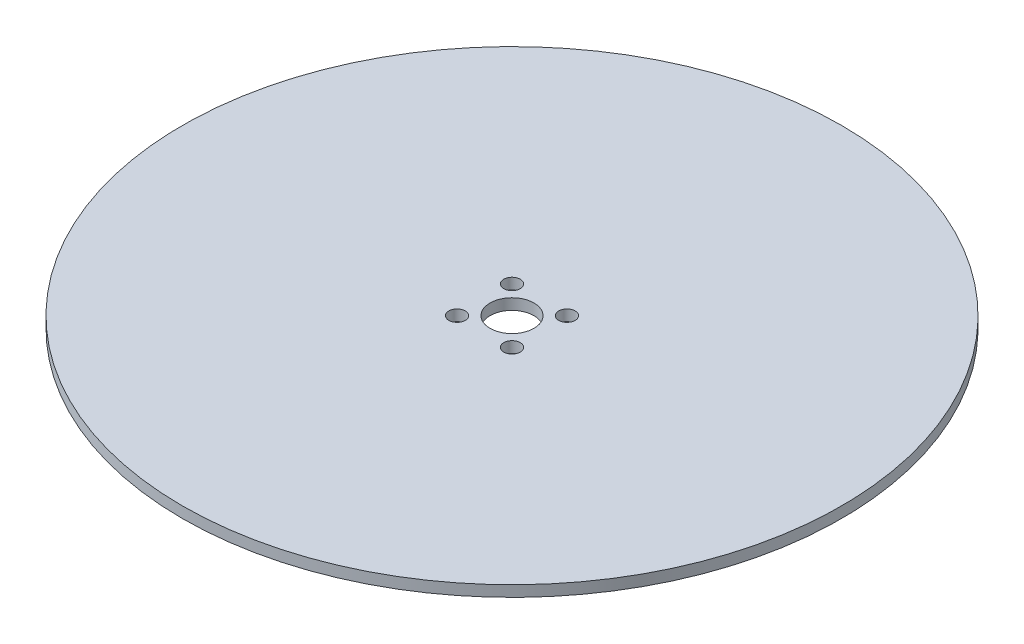
ISO-10303-21;
HEADER;
FILE_DESCRIPTION(('STEP AP214'),'2;1');
FILE_NAME('part.step','',(''),(''),'','','');
FILE_SCHEMA(('AUTOMOTIVE_DESIGN { 1 0 10303 214 1 1 1 1 }'));
ENDSEC;
DATA;
#1=APPLICATION_CONTEXT('core data for automotive mechanical design processes');
#2=APPLICATION_PROTOCOL_DEFINITION('international standard','automotive_design',2000,#1);
#3=PRODUCT_CONTEXT('',#1,'mechanical');
#4=PRODUCT('Part','Part','',(#3));
#5=PRODUCT_RELATED_PRODUCT_CATEGORY('part','',(#4));
#6=PRODUCT_DEFINITION_FORMATION('','',#4);
#7=PRODUCT_DEFINITION_CONTEXT('part definition',#1,'design');
#8=PRODUCT_DEFINITION('design','',#6,#7);
#9=PRODUCT_DEFINITION_SHAPE('','',#8);
#10=(LENGTH_UNIT() NAMED_UNIT(*) SI_UNIT(.MILLI.,.METRE.));
#11=(NAMED_UNIT(*) PLANE_ANGLE_UNIT() SI_UNIT($,.RADIAN.));
#12=(NAMED_UNIT(*) SI_UNIT($,.STERADIAN.) SOLID_ANGLE_UNIT());
#13=UNCERTAINTY_MEASURE_WITH_UNIT(LENGTH_MEASURE(1.E-05),#10,'distance_accuracy_value','');
#14=(GEOMETRIC_REPRESENTATION_CONTEXT(3) GLOBAL_UNCERTAINTY_ASSIGNED_CONTEXT((#13)) GLOBAL_UNIT_ASSIGNED_CONTEXT((#10,
#11,#12)) REPRESENTATION_CONTEXT('',''));
#15=CARTESIAN_POINT('',(0.,0.,0.));
#16=DIRECTION('',(0.,0.,1.));
#17=DIRECTION('',(1.,0.,0.));
#18=AXIS2_PLACEMENT_3D('',#15,#16,#17);
#19=CARTESIAN_POINT('',(0.,2.,0.));
#20=DIRECTION('',(0.,-1.,0.));
#21=DIRECTION('',(0.,0.,-1.));
#22=AXIS2_PLACEMENT_3D('',#19,#20,#21);
#23=CYLINDRICAL_SURFACE('',#22,60.);
#24=CARTESIAN_POINT('',(0.,2.,0.));
#25=DIRECTION('',(0.,1.,0.));
#26=DIRECTION('',(0.,0.,1.));
#27=AXIS2_PLACEMENT_3D('',#24,#25,#26);
#28=CIRCLE('',#27,60.);
#29=CARTESIAN_POINT('',(0.,2.,60.));
#30=VERTEX_POINT('',#29);
#31=EDGE_CURVE('E11',#30,#30,#28,.T.);
#32=ORIENTED_EDGE('',*,*,#31,.F.);
#33=EDGE_LOOP('',(#32));
#34=FACE_BOUND('',#33,.T.);
#35=CARTESIAN_POINT('',(0.,0.,0.));
#36=DIRECTION('',(0.,1.,0.));
#37=DIRECTION('',(0.,0.,1.));
#38=AXIS2_PLACEMENT_3D('',#35,#36,#37);
#39=CIRCLE('',#38,60.);
#40=CARTESIAN_POINT('',(0.,0.,60.));
#41=VERTEX_POINT('',#40);
#42=EDGE_CURVE('E63',#41,#41,#39,.T.);
#43=ORIENTED_EDGE('',*,*,#42,.T.);
#44=EDGE_LOOP('',(#43));
#45=FACE_BOUND('',#44,.T.);
#46=ADVANCED_FACE('F60',(#34,#45),#23,.T.);
#47=CARTESIAN_POINT('',(0.,2.,0.));
#48=DIRECTION('',(0.,1.,0.));
#49=DIRECTION('',(0.,0.,1.));
#50=AXIS2_PLACEMENT_3D('',#47,#48,#49);
#51=PLANE('',#50);
#52=CARTESIAN_POINT('',(0.,2.,0.));
#53=DIRECTION('',(0.,1.,0.));
#54=DIRECTION('',(0.,0.,1.));
#55=AXIS2_PLACEMENT_3D('',#52,#53,#54);
#56=CIRCLE('',#55,4.);
#57=CARTESIAN_POINT('',(0.,2.,4.));
#58=VERTEX_POINT('',#57);
#59=EDGE_CURVE('E84',#58,#58,#56,.T.);
#60=ORIENTED_EDGE('',*,*,#59,.F.);
#61=EDGE_LOOP('',(#60));
#62=FACE_BOUND('',#61,.T.);
#63=CARTESIAN_POINT('',(5.,2.,-5.));
#64=DIRECTION('',(0.,1.,0.));
#65=DIRECTION('',(0.,0.,1.));
#66=AXIS2_PLACEMENT_3D('',#63,#64,#65);
#67=CIRCLE('',#66,1.5);
#68=CARTESIAN_POINT('',(5.,2.,-3.5));
#69=VERTEX_POINT('',#68);
#70=EDGE_CURVE('E78',#69,#69,#67,.T.);
#71=ORIENTED_EDGE('',*,*,#70,.F.);
#72=EDGE_LOOP('',(#71));
#73=FACE_BOUND('',#72,.T.);
#74=CARTESIAN_POINT('',(5.,2.,5.));
#75=DIRECTION('',(0.,1.,0.));
#76=DIRECTION('',(0.,0.,1.));
#77=AXIS2_PLACEMENT_3D('',#74,#75,#76);
#78=CIRCLE('',#77,1.5);
#79=CARTESIAN_POINT('',(5.,2.,6.5));
#80=VERTEX_POINT('',#79);
#81=EDGE_CURVE('E96',#80,#80,#78,.T.);
#82=ORIENTED_EDGE('',*,*,#81,.F.);
#83=EDGE_LOOP('',(#82));
#84=FACE_BOUND('',#83,.T.);
#85=CARTESIAN_POINT('',(-5.,2.,5.));
#86=DIRECTION('',(0.,1.,0.));
#87=DIRECTION('',(0.,0.,1.));
#88=AXIS2_PLACEMENT_3D('',#85,#86,#87);
#89=CIRCLE('',#88,1.5);
#90=CARTESIAN_POINT('',(-5.,2.,6.5));
#91=VERTEX_POINT('',#90);
#92=EDGE_CURVE('E90',#91,#91,#89,.T.);
#93=ORIENTED_EDGE('',*,*,#92,.F.);
#94=EDGE_LOOP('',(#93));
#95=FACE_BOUND('',#94,.T.);
#96=CARTESIAN_POINT('',(-5.,2.,-5.));
#97=DIRECTION('',(0.,1.,0.));
#98=DIRECTION('',(0.,0.,1.));
#99=AXIS2_PLACEMENT_3D('',#96,#97,#98);
#100=CIRCLE('',#99,1.5);
#101=CARTESIAN_POINT('',(-5.,2.,-3.5));
#102=VERTEX_POINT('',#101);
#103=EDGE_CURVE('E72',#102,#102,#100,.T.);
#104=ORIENTED_EDGE('',*,*,#103,.F.);
#105=EDGE_LOOP('',(#104));
#106=FACE_BOUND('',#105,.T.);
#107=ORIENTED_EDGE('',*,*,#31,.T.);
#108=EDGE_LOOP('',(#107));
#109=FACE_BOUND('',#108,.T.);
#110=ADVANCED_FACE('F113',(#62,#73,#84,#95,#106,#109),#51,.T.);
#111=CARTESIAN_POINT('',(0.,0.,0.));
#112=DIRECTION('',(0.,1.,0.));
#113=DIRECTION('',(0.,0.,1.));
#114=AXIS2_PLACEMENT_3D('',#111,#112,#113);
#115=PLANE('',#114);
#116=CARTESIAN_POINT('',(0.,0.,0.));
#117=DIRECTION('',(0.,1.,0.));
#118=DIRECTION('',(0.,0.,1.));
#119=AXIS2_PLACEMENT_3D('',#116,#117,#118);
#120=CIRCLE('',#119,4.);
#121=CARTESIAN_POINT('',(0.,0.,4.));
#122=VERTEX_POINT('',#121);
#123=EDGE_CURVE('E81',#122,#122,#120,.T.);
#124=ORIENTED_EDGE('',*,*,#123,.T.);
#125=EDGE_LOOP('',(#124));
#126=FACE_BOUND('',#125,.T.);
#127=CARTESIAN_POINT('',(5.,0.,-5.));
#128=DIRECTION('',(0.,1.,0.));
#129=DIRECTION('',(0.,0.,1.));
#130=AXIS2_PLACEMENT_3D('',#127,#128,#129);
#131=CIRCLE('',#130,1.5);
#132=CARTESIAN_POINT('',(5.,0.,-3.5));
#133=VERTEX_POINT('',#132);
#134=EDGE_CURVE('E75',#133,#133,#131,.T.);
#135=ORIENTED_EDGE('',*,*,#134,.T.);
#136=EDGE_LOOP('',(#135));
#137=FACE_BOUND('',#136,.T.);
#138=CARTESIAN_POINT('',(5.,0.,5.));
#139=DIRECTION('',(0.,1.,0.));
#140=DIRECTION('',(0.,0.,1.));
#141=AXIS2_PLACEMENT_3D('',#138,#139,#140);
#142=CIRCLE('',#141,1.5);
#143=CARTESIAN_POINT('',(5.,0.,6.5));
#144=VERTEX_POINT('',#143);
#145=EDGE_CURVE('E87',#144,#144,#142,.T.);
#146=ORIENTED_EDGE('',*,*,#145,.T.);
#147=EDGE_LOOP('',(#146));
#148=FACE_BOUND('',#147,.T.);
#149=CARTESIAN_POINT('',(-5.,0.,5.));
#150=DIRECTION('',(0.,1.,0.));
#151=DIRECTION('',(0.,0.,1.));
#152=AXIS2_PLACEMENT_3D('',#149,#150,#151);
#153=CIRCLE('',#152,1.5);
#154=CARTESIAN_POINT('',(-5.,0.,6.5));
#155=VERTEX_POINT('',#154);
#156=EDGE_CURVE('E93',#155,#155,#153,.T.);
#157=ORIENTED_EDGE('',*,*,#156,.T.);
#158=EDGE_LOOP('',(#157));
#159=FACE_BOUND('',#158,.T.);
#160=CARTESIAN_POINT('',(-5.,0.,-5.));
#161=DIRECTION('',(0.,1.,0.));
#162=DIRECTION('',(0.,0.,1.));
#163=AXIS2_PLACEMENT_3D('',#160,#161,#162);
#164=CIRCLE('',#163,1.5);
#165=CARTESIAN_POINT('',(-5.,0.,-3.5));
#166=VERTEX_POINT('',#165);
#167=EDGE_CURVE('E70',#166,#166,#164,.T.);
#168=ORIENTED_EDGE('',*,*,#167,.T.);
#169=EDGE_LOOP('',(#168));
#170=FACE_BOUND('',#169,.T.);
#171=ORIENTED_EDGE('',*,*,#42,.F.);
#172=EDGE_LOOP('',(#171));
#173=FACE_BOUND('',#172,.T.);
#174=ADVANCED_FACE('F102',(#126,#137,#148,#159,#170,#173),#115,.F.);
#175=CARTESIAN_POINT('',(-5.,0.,-5.));
#176=DIRECTION('',(0.,1.,0.));
#177=DIRECTION('',(0.,0.,1.));
#178=AXIS2_PLACEMENT_3D('',#175,#176,#177);
#179=CYLINDRICAL_SURFACE('',#178,1.5);
#180=ORIENTED_EDGE('',*,*,#167,.F.);
#181=EDGE_LOOP('',(#180));
#182=FACE_BOUND('',#181,.T.);
#183=ORIENTED_EDGE('',*,*,#103,.T.);
#184=EDGE_LOOP('',(#183));
#185=FACE_BOUND('',#184,.T.);
#186=ADVANCED_FACE('F122',(#182,#185),#179,.F.);
#187=CARTESIAN_POINT('',(-5.,0.,5.));
#188=DIRECTION('',(0.,1.,0.));
#189=DIRECTION('',(0.,0.,1.));
#190=AXIS2_PLACEMENT_3D('',#187,#188,#189);
#191=CYLINDRICAL_SURFACE('',#190,1.5);
#192=ORIENTED_EDGE('',*,*,#156,.F.);
#193=EDGE_LOOP('',(#192));
#194=FACE_BOUND('',#193,.T.);
#195=ORIENTED_EDGE('',*,*,#92,.T.);
#196=EDGE_LOOP('',(#195));
#197=FACE_BOUND('',#196,.T.);
#198=ADVANCED_FACE('F109',(#194,#197),#191,.F.);
#199=CARTESIAN_POINT('',(5.,0.,5.));
#200=DIRECTION('',(0.,1.,0.));
#201=DIRECTION('',(0.,0.,1.));
#202=AXIS2_PLACEMENT_3D('',#199,#200,#201);
#203=CYLINDRICAL_SURFACE('',#202,1.5);
#204=ORIENTED_EDGE('',*,*,#145,.F.);
#205=EDGE_LOOP('',(#204));
#206=FACE_BOUND('',#205,.T.);
#207=ORIENTED_EDGE('',*,*,#81,.T.);
#208=EDGE_LOOP('',(#207));
#209=FACE_BOUND('',#208,.T.);
#210=ADVANCED_FACE('F105',(#206,#209),#203,.F.);
#211=CARTESIAN_POINT('',(5.,0.,-5.));
#212=DIRECTION('',(0.,1.,0.));
#213=DIRECTION('',(0.,0.,1.));
#214=AXIS2_PLACEMENT_3D('',#211,#212,#213);
#215=CYLINDRICAL_SURFACE('',#214,1.5);
#216=ORIENTED_EDGE('',*,*,#134,.F.);
#217=EDGE_LOOP('',(#216));
#218=FACE_BOUND('',#217,.T.);
#219=ORIENTED_EDGE('',*,*,#70,.T.);
#220=EDGE_LOOP('',(#219));
#221=FACE_BOUND('',#220,.T.);
#222=ADVANCED_FACE('F108',(#218,#221),#215,.F.);
#223=CARTESIAN_POINT('',(0.,0.,0.));
#224=DIRECTION('',(0.,1.,0.));
#225=DIRECTION('',(0.,0.,1.));
#226=AXIS2_PLACEMENT_3D('',#223,#224,#225);
#227=CYLINDRICAL_SURFACE('',#226,4.);
#228=ORIENTED_EDGE('',*,*,#123,.F.);
#229=EDGE_LOOP('',(#228));
#230=FACE_BOUND('',#229,.T.);
#231=ORIENTED_EDGE('',*,*,#59,.T.);
#232=EDGE_LOOP('',(#231));
#233=FACE_BOUND('',#232,.T.);
#234=ADVANCED_FACE('F179',(#230,#233),#227,.F.);
#235=CLOSED_SHELL('',(#46,#110,#174,#186,#198,#210,#222,#234));
#236=MANIFOLD_SOLID_BREP('B2',#235);
#237=ADVANCED_BREP_SHAPE_REPRESENTATION('',(#18,#236),#14);
#238=SHAPE_DEFINITION_REPRESENTATION(#9,#237);
ENDSEC;
END-ISO-10303-21;
